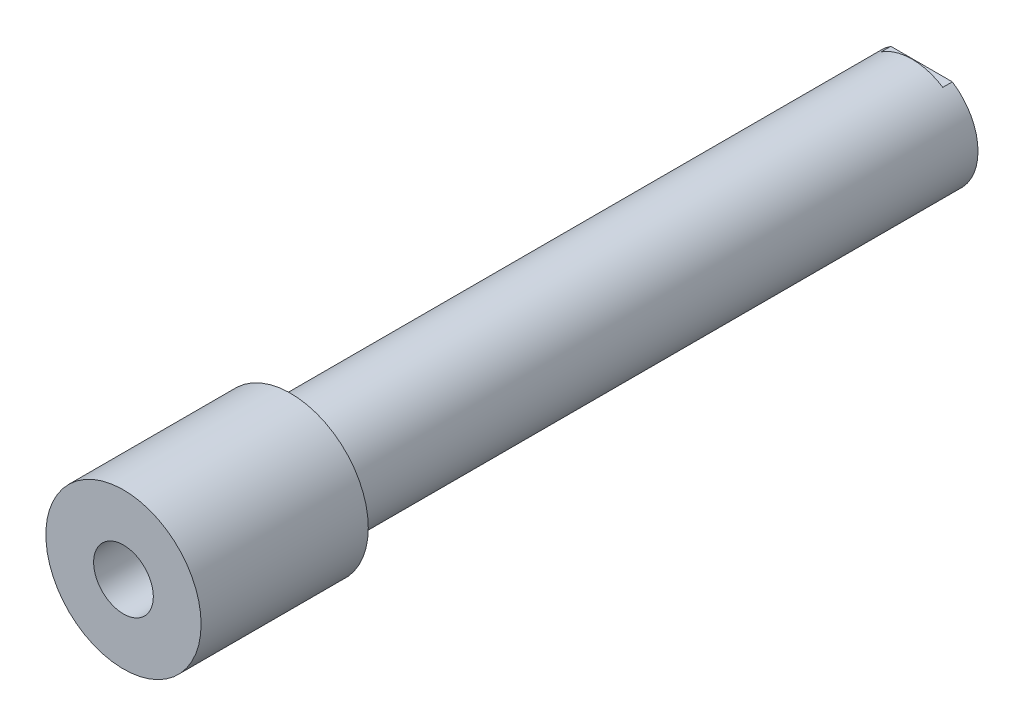
ISO-10303-21;
HEADER;
FILE_DESCRIPTION(('STEP AP214'),'2;1');
FILE_NAME('part.step','',(''),(''),'','','');
FILE_SCHEMA(('AUTOMOTIVE_DESIGN { 1 0 10303 214 1 1 1 1 }'));
ENDSEC;
DATA;
#1=APPLICATION_CONTEXT('core data for automotive mechanical design processes');
#2=APPLICATION_PROTOCOL_DEFINITION('international standard','automotive_design',2000,#1);
#3=PRODUCT_CONTEXT('',#1,'mechanical');
#4=PRODUCT('Part','Part','',(#3));
#5=PRODUCT_RELATED_PRODUCT_CATEGORY('part','',(#4));
#6=PRODUCT_DEFINITION_FORMATION('','',#4);
#7=PRODUCT_DEFINITION_CONTEXT('part definition',#1,'design');
#8=PRODUCT_DEFINITION('design','',#6,#7);
#9=PRODUCT_DEFINITION_SHAPE('','',#8);
#10=(LENGTH_UNIT() NAMED_UNIT(*) SI_UNIT(.MILLI.,.METRE.));
#11=(NAMED_UNIT(*) PLANE_ANGLE_UNIT() SI_UNIT($,.RADIAN.));
#12=(NAMED_UNIT(*) SI_UNIT($,.STERADIAN.) SOLID_ANGLE_UNIT());
#13=UNCERTAINTY_MEASURE_WITH_UNIT(LENGTH_MEASURE(1.E-05),#10,'distance_accuracy_value','');
#14=(GEOMETRIC_REPRESENTATION_CONTEXT(3) GLOBAL_UNCERTAINTY_ASSIGNED_CONTEXT((#13)) GLOBAL_UNIT_ASSIGNED_CONTEXT((#10,
#11,#12)) REPRESENTATION_CONTEXT('',''));
#15=CARTESIAN_POINT('',(0.,0.,0.));
#16=DIRECTION('',(0.,0.,1.));
#17=DIRECTION('',(1.,0.,0.));
#18=AXIS2_PLACEMENT_3D('',#15,#16,#17);
#19=CARTESIAN_POINT('',(0.,0.,33.7312));
#20=DIRECTION('',(0.,0.,-1.));
#21=DIRECTION('',(-1.,0.,0.));
#22=AXIS2_PLACEMENT_3D('',#19,#20,#21);
#23=CYLINDRICAL_SURFACE('',#22,4.96062);
#24=CARTESIAN_POINT('',(0.,0.,29.21));
#25=DIRECTION('',(0.,0.,-1.));
#26=DIRECTION('',(0.,1.,0.));
#27=AXIS2_PLACEMENT_3D('',#24,#25,#26);
#28=CIRCLE('',#27,4.96062);
#29=CARTESIAN_POINT('',(0.,4.96062,29.21));
#30=VERTEX_POINT('',#29);
#31=EDGE_CURVE('E10',#30,#30,#28,.T.);
#32=ORIENTED_EDGE('',*,*,#31,.F.);
#33=EDGE_LOOP('',(#32));
#34=FACE_BOUND('',#33,.T.);
#35=CARTESIAN_POINT('',(0.,0.,0.));
#36=DIRECTION('',(0.,0.,-1.));
#37=DIRECTION('',(-1.,0.,0.));
#38=AXIS2_PLACEMENT_3D('',#35,#36,#37);
#39=CIRCLE('',#38,4.96062);
#40=CARTESIAN_POINT('',(-4.96062,0.,0.));
#41=VERTEX_POINT('',#40);
#42=EDGE_CURVE('E77',#41,#41,#39,.T.);
#43=ORIENTED_EDGE('',*,*,#42,.T.);
#44=EDGE_LOOP('',(#43));
#45=FACE_BOUND('',#44,.T.);
#46=ADVANCED_FACE('F16',(#34,#45),#23,.F.);
#47=CARTESIAN_POINT('',(0.,0.,3.81));
#48=DIRECTION('',(0.,0.,1.));
#49=DIRECTION('',(1.,0.,0.));
#50=AXIS2_PLACEMENT_3D('',#47,#48,#49);
#51=CYLINDRICAL_SURFACE('',#50,11.1125);
#52=CARTESIAN_POINT('',(0.,0.,167.7416));
#53=DIRECTION('',(0.,0.,1.));
#54=DIRECTION('',(1.,0.,0.));
#55=AXIS2_PLACEMENT_3D('',#52,#53,#54);
#56=CIRCLE('',#55,11.1125);
#57=CARTESIAN_POINT('',(11.1125,0.,167.7416));
#58=VERTEX_POINT('',#57);
#59=EDGE_CURVE('E125',#58,#58,#56,.F.);
#60=ORIENTED_EDGE('',*,*,#59,.F.);
#61=EDGE_LOOP('',(#60));
#62=FACE_BOUND('',#61,.T.);
#63=CARTESIAN_POINT('',(0.,0.,59.0169));
#64=DIRECTION('',(0.,0.,-1.));
#65=DIRECTION('',(-1.,0.,0.));
#66=AXIS2_PLACEMENT_3D('',#63,#64,#65);
#67=CIRCLE('',#66,11.1125);
#68=CARTESIAN_POINT('',(-11.1125,0.,59.0169));
#69=VERTEX_POINT('',#68);
#70=EDGE_CURVE('E25',#69,#69,#67,.F.);
#71=ORIENTED_EDGE('',*,*,#70,.F.);
#72=EDGE_LOOP('',(#71));
#73=FACE_BOUND('',#72,.T.);
#74=ADVANCED_FACE('F72',(#62,#73),#51,.F.);
#75=CARTESIAN_POINT('',(0.,0.,167.7416));
#76=DIRECTION('',(0.,0.,1.));
#77=DIRECTION('',(1.,0.,0.));
#78=AXIS2_PLACEMENT_3D('',#75,#76,#77);
#79=PLANE('',#78);
#80=CARTESIAN_POINT('',(0.,0.,167.7416));
#81=DIRECTION('',(0.,0.,1.));
#82=DIRECTION('',(1.,0.,0.));
#83=AXIS2_PLACEMENT_3D('',#80,#81,#82);
#84=CIRCLE('',#83,20.6375);
#85=CARTESIAN_POINT('',(20.6375,0.,167.7416));
#86=VERTEX_POINT('',#85);
#87=EDGE_CURVE('E115',#86,#86,#84,.T.);
#88=ORIENTED_EDGE('',*,*,#87,.F.);
#89=EDGE_LOOP('',(#88));
#90=FACE_BOUND('',#89,.T.);
#91=CARTESIAN_POINT('',(0.,0.,167.7416));
#92=DIRECTION('',(0.,0.,1.));
#93=DIRECTION('',(1.,0.,0.));
#94=AXIS2_PLACEMENT_3D('',#91,#92,#93);
#95=CIRCLE('',#94,14.9987);
#96=CARTESIAN_POINT('',(14.9987,0.,167.7416));
#97=VERTEX_POINT('',#96);
#98=EDGE_CURVE('E122',#97,#97,#95,.F.);
#99=ORIENTED_EDGE('',*,*,#98,.F.);
#100=EDGE_LOOP('',(#99));
#101=FACE_BOUND('',#100,.T.);
#102=ADVANCED_FACE('F132',(#90,#101),#79,.F.);
#103=ORIENTED_EDGE('',*,*,#59,.T.);
#104=EDGE_LOOP('',(#103));
#105=FACE_BOUND('',#104,.T.);
#106=CARTESIAN_POINT('',(0.,0.,167.7416));
#107=DIRECTION('',(0.,0.,1.));
#108=DIRECTION('',(1.,0.,0.));
#109=AXIS2_PLACEMENT_3D('',#106,#107,#108);
#110=CIRCLE('',#109,7.9375);
#111=CARTESIAN_POINT('',(7.9375,0.,167.7416));
#112=VERTEX_POINT('',#111);
#113=EDGE_CURVE('E108',#112,#112,#110,.T.);
#114=ORIENTED_EDGE('',*,*,#113,.T.);
#115=EDGE_LOOP('',(#114));
#116=FACE_BOUND('',#115,.T.);
#117=ADVANCED_FACE('F134',(#105,#116),#79,.F.);
#118=CARTESIAN_POINT('',(0.,0.,212.1916));
#119=DIRECTION('',(0.,0.,1.));
#120=DIRECTION('',(1.,0.,0.));
#121=AXIS2_PLACEMENT_3D('',#118,#119,#120);
#122=PLANE('',#121);
#123=CARTESIAN_POINT('',(0.,0.,212.1916));
#124=DIRECTION('',(0.,0.,1.));
#125=DIRECTION('',(1.,0.,0.));
#126=AXIS2_PLACEMENT_3D('',#123,#124,#125);
#127=CIRCLE('',#126,20.6375);
#128=CARTESIAN_POINT('',(20.6375,0.,212.1916));
#129=VERTEX_POINT('',#128);
#130=EDGE_CURVE('E119',#129,#129,#127,.T.);
#131=ORIENTED_EDGE('',*,*,#130,.T.);
#132=EDGE_LOOP('',(#131));
#133=FACE_BOUND('',#132,.T.);
#134=CARTESIAN_POINT('',(0.,0.,212.1916));
#135=DIRECTION('',(0.,0.,1.));
#136=DIRECTION('',(1.,0.,0.));
#137=AXIS2_PLACEMENT_3D('',#134,#135,#136);
#138=CIRCLE('',#137,7.9375);
#139=CARTESIAN_POINT('',(7.9375,0.,212.1916));
#140=VERTEX_POINT('',#139);
#141=EDGE_CURVE('E110',#140,#140,#138,.T.);
#142=ORIENTED_EDGE('',*,*,#141,.F.);
#143=EDGE_LOOP('',(#142));
#144=FACE_BOUND('',#143,.T.);
#145=ADVANCED_FACE('F143',(#133,#144),#122,.T.);
#146=CARTESIAN_POINT('',(0.,0.,212.1916));
#147=DIRECTION('',(0.,0.,-1.));
#148=DIRECTION('',(-1.,0.,0.));
#149=AXIS2_PLACEMENT_3D('',#146,#147,#148);
#150=CYLINDRICAL_SURFACE('',#149,20.6375);
#151=ORIENTED_EDGE('',*,*,#130,.F.);
#152=EDGE_LOOP('',(#151));
#153=FACE_BOUND('',#152,.T.);
#154=ORIENTED_EDGE('',*,*,#87,.T.);
#155=EDGE_LOOP('',(#154));
#156=FACE_BOUND('',#155,.T.);
#157=ADVANCED_FACE('F151',(#153,#156),#150,.T.);
#158=CARTESIAN_POINT('',(0.,0.,212.1916));
#159=DIRECTION('',(0.,0.,-1.));
#160=DIRECTION('',(-1.,0.,0.));
#161=AXIS2_PLACEMENT_3D('',#158,#159,#160);
#162=CYLINDRICAL_SURFACE('',#161,7.9375);
#163=ORIENTED_EDGE('',*,*,#141,.T.);
#164=EDGE_LOOP('',(#163));
#165=FACE_BOUND('',#164,.T.);
#166=ORIENTED_EDGE('',*,*,#113,.F.);
#167=EDGE_LOOP('',(#166));
#168=FACE_BOUND('',#167,.T.);
#169=ADVANCED_FACE('F153',(#165,#168),#162,.F.);
#170=CARTESIAN_POINT('',(0.,0.,167.7416));
#171=DIRECTION('',(0.,0.,-1.));
#172=DIRECTION('',(-1.,0.,0.));
#173=AXIS2_PLACEMENT_3D('',#170,#171,#172);
#174=CYLINDRICAL_SURFACE('',#173,14.9987);
#175=ORIENTED_EDGE('',*,*,#98,.T.);
#176=EDGE_LOOP('',(#175));
#177=FACE_BOUND('',#176,.T.);
#178=CARTESIAN_POINT('',(0.,0.,0.));
#179=DIRECTION('',(0.,0.,-1.));
#180=DIRECTION('',(-1.,0.,0.));
#181=AXIS2_PLACEMENT_3D('',#178,#179,#180);
#182=CIRCLE('',#181,14.9987);
#183=CARTESIAN_POINT('',(8.17806044793018,12.573,0.));
#184=VERTEX_POINT('',#183);
#185=CARTESIAN_POINT('',(8.17806044793018,-12.573,0.));
#186=VERTEX_POINT('',#185);
#187=EDGE_CURVE('E99',#184,#186,#182,.T.);
#188=ORIENTED_EDGE('',*,*,#187,.F.);
#189=DIRECTION('',(0.,0.,-1.));
#190=VECTOR('',#189,1.);
#191=CARTESIAN_POINT('',(8.17806044793018,12.573,2.54));
#192=LINE('',#191,#190);
#193=CARTESIAN_POINT('',(8.17806044793018,12.573,2.54));
#194=VERTEX_POINT('',#193);
#195=EDGE_CURVE('E41',#194,#184,#192,.T.);
#196=ORIENTED_EDGE('',*,*,#195,.F.);
#197=CARTESIAN_POINT('',(0.,0.,2.54));
#198=DIRECTION('',(0.,0.,-1.));
#199=DIRECTION('',(-1.,0.,0.));
#200=AXIS2_PLACEMENT_3D('',#197,#198,#199);
#201=CIRCLE('',#200,14.9987);
#202=CARTESIAN_POINT('',(-8.17806044793018,12.573,2.54));
#203=VERTEX_POINT('',#202);
#204=EDGE_CURVE('E103',#194,#203,#201,.F.);
#205=ORIENTED_EDGE('',*,*,#204,.T.);
#206=DIRECTION('',(0.,0.,-1.));
#207=VECTOR('',#206,1.);
#208=CARTESIAN_POINT('',(-8.17806044793018,12.573,2.54));
#209=LINE('',#208,#207);
#210=CARTESIAN_POINT('',(-8.17806044793018,12.573,0.));
#211=VERTEX_POINT('',#210);
#212=EDGE_CURVE('E93',#203,#211,#209,.T.);
#213=ORIENTED_EDGE('',*,*,#212,.T.);
#214=CARTESIAN_POINT('',(-8.17806044793018,-12.573,0.));
#215=VERTEX_POINT('',#214);
#216=EDGE_CURVE('E92',#215,#211,#182,.T.);
#217=ORIENTED_EDGE('',*,*,#216,.F.);
#218=DIRECTION('',(0.,0.,-1.));
#219=VECTOR('',#218,1.);
#220=CARTESIAN_POINT('',(-8.17806044793018,-12.573,2.54));
#221=LINE('',#220,#219);
#222=CARTESIAN_POINT('',(-8.17806044793018,-12.573,2.54));
#223=VERTEX_POINT('',#222);
#224=EDGE_CURVE('E33',#223,#215,#221,.T.);
#225=ORIENTED_EDGE('',*,*,#224,.F.);
#226=CARTESIAN_POINT('',(8.17806044793018,-12.573,2.54));
#227=VERTEX_POINT('',#226);
#228=EDGE_CURVE('E20',#223,#227,#201,.F.);
#229=ORIENTED_EDGE('',*,*,#228,.T.);
#230=DIRECTION('',(0.,0.,-1.));
#231=VECTOR('',#230,1.);
#232=CARTESIAN_POINT('',(8.17806044793018,-12.573,2.54));
#233=LINE('',#232,#231);
#234=EDGE_CURVE('E88',#227,#186,#233,.T.);
#235=ORIENTED_EDGE('',*,*,#234,.T.);
#236=EDGE_LOOP('',(#188,#196,#205,#213,#217,#225,#229,#235));
#237=FACE_BOUND('',#236,.T.);
#238=ADVANCED_FACE('F130',(#177,#237),#174,.T.);
#239=CARTESIAN_POINT('',(0.,0.,59.0169));
#240=DIRECTION('',(0.,0.,-1.));
#241=DIRECTION('',(-1.,0.,0.));
#242=AXIS2_PLACEMENT_3D('',#239,#240,#241);
#243=PLANE('',#242);
#244=ORIENTED_EDGE('',*,*,#70,.T.);
#245=EDGE_LOOP('',(#244));
#246=FACE_BOUND('',#245,.T.);
#247=ADVANCED_FACE('F66',(#246),#243,.F.);
#248=CARTESIAN_POINT('',(0.,0.,29.21));
#249=DIRECTION('',(0.,0.,-1.));
#250=DIRECTION('',(-1.,0.,0.));
#251=AXIS2_PLACEMENT_3D('',#248,#249,#250);
#252=CONICAL_SURFACE('',#251,4.96062,1.02974425867665);
#253=CARTESIAN_POINT('',(0.,0.,32.1906412039605));
#254=VERTEX_POINT('',#253);
#255=VERTEX_LOOP('',#254);
#256=FACE_BOUND('',#255,.T.);
#257=ORIENTED_EDGE('',*,*,#31,.T.);
#258=EDGE_LOOP('',(#257));
#259=FACE_BOUND('',#258,.T.);
#260=ADVANCED_FACE('F62',(#256,#259),#252,.F.);
#261=CARTESIAN_POINT('',(0.,0.,2.54));
#262=DIRECTION('',(0.,0.,-1.));
#263=DIRECTION('',(-1.,0.,0.));
#264=AXIS2_PLACEMENT_3D('',#261,#262,#263);
#265=PLANE('',#264);
#266=DIRECTION('',(-1.,0.,0.));
#267=VECTOR('',#266,1.);
#268=CARTESIAN_POINT('',(8.17806044793018,-12.573,2.54));
#269=LINE('',#268,#267);
#270=EDGE_CURVE('E85',#227,#223,#269,.T.);
#271=ORIENTED_EDGE('',*,*,#270,.F.);
#272=ORIENTED_EDGE('',*,*,#228,.F.);
#273=EDGE_LOOP('',(#271,#272));
#274=FACE_BOUND('',#273,.T.);
#275=ADVANCED_FACE('F65',(#274),#265,.T.);
#276=CARTESIAN_POINT('',(8.17806044793018,-12.573,2.54));
#277=DIRECTION('',(0.,-1.,0.));
#278=DIRECTION('',(0.,0.,1.));
#279=AXIS2_PLACEMENT_3D('',#276,#277,#278);
#280=PLANE('',#279);
#281=DIRECTION('',(-1.,0.,0.));
#282=VECTOR('',#281,1.);
#283=CARTESIAN_POINT('',(8.17806044793018,-12.573,0.));
#284=LINE('',#283,#282);
#285=EDGE_CURVE('E79',#186,#215,#284,.T.);
#286=ORIENTED_EDGE('',*,*,#285,.F.);
#287=ORIENTED_EDGE('',*,*,#234,.F.);
#288=ORIENTED_EDGE('',*,*,#270,.T.);
#289=ORIENTED_EDGE('',*,*,#224,.T.);
#290=EDGE_LOOP('',(#286,#287,#288,#289));
#291=FACE_BOUND('',#290,.T.);
#292=ADVANCED_FACE('F161',(#291),#280,.T.);
#293=DIRECTION('',(1.,0.,0.));
#294=VECTOR('',#293,1.);
#295=CARTESIAN_POINT('',(8.17806044793018,12.573,2.54));
#296=LINE('',#295,#294);
#297=EDGE_CURVE('E87',#203,#194,#296,.T.);
#298=ORIENTED_EDGE('',*,*,#297,.F.);
#299=ORIENTED_EDGE('',*,*,#204,.F.);
#300=EDGE_LOOP('',(#298,#299));
#301=FACE_BOUND('',#300,.T.);
#302=ADVANCED_FACE('F160',(#301),#265,.T.);
#303=CARTESIAN_POINT('',(8.17806044793018,12.573,2.54));
#304=DIRECTION('',(0.,1.,0.));
#305=DIRECTION('',(0.,0.,-1.));
#306=AXIS2_PLACEMENT_3D('',#303,#304,#305);
#307=PLANE('',#306);
#308=DIRECTION('',(1.,0.,0.));
#309=VECTOR('',#308,1.);
#310=CARTESIAN_POINT('',(8.17806044793018,12.573,0.));
#311=LINE('',#310,#309);
#312=EDGE_CURVE('E81',#211,#184,#311,.T.);
#313=ORIENTED_EDGE('',*,*,#312,.F.);
#314=ORIENTED_EDGE('',*,*,#212,.F.);
#315=ORIENTED_EDGE('',*,*,#297,.T.);
#316=ORIENTED_EDGE('',*,*,#195,.T.);
#317=EDGE_LOOP('',(#313,#314,#315,#316));
#318=FACE_BOUND('',#317,.T.);
#319=ADVANCED_FACE('F74',(#318),#307,.T.);
#320=CARTESIAN_POINT('',(0.,0.,0.));
#321=DIRECTION('',(0.,0.,-1.));
#322=DIRECTION('',(-1.,0.,0.));
#323=AXIS2_PLACEMENT_3D('',#320,#321,#322);
#324=PLANE('',#323);
#325=ORIENTED_EDGE('',*,*,#42,.F.);
#326=EDGE_LOOP('',(#325));
#327=FACE_BOUND('',#326,.T.);
#328=ORIENTED_EDGE('',*,*,#216,.T.);
#329=ORIENTED_EDGE('',*,*,#312,.T.);
#330=ORIENTED_EDGE('',*,*,#187,.T.);
#331=ORIENTED_EDGE('',*,*,#285,.T.);
#332=EDGE_LOOP('',(#328,#329,#330,#331));
#333=FACE_BOUND('',#332,.T.);
#334=ADVANCED_FACE('F18',(#327,#333),#324,.T.);
#335=CLOSED_SHELL('',(#46,#74,#102,#117,#145,#157,#169,#238,#247,#260,#275,#292,#302,#319,#334));
#336=MANIFOLD_SOLID_BREP('B1',#335);
#337=ADVANCED_BREP_SHAPE_REPRESENTATION('',(#18,#336),#14);
#338=SHAPE_DEFINITION_REPRESENTATION(#9,#337);
ENDSEC;
END-ISO-10303-21;
